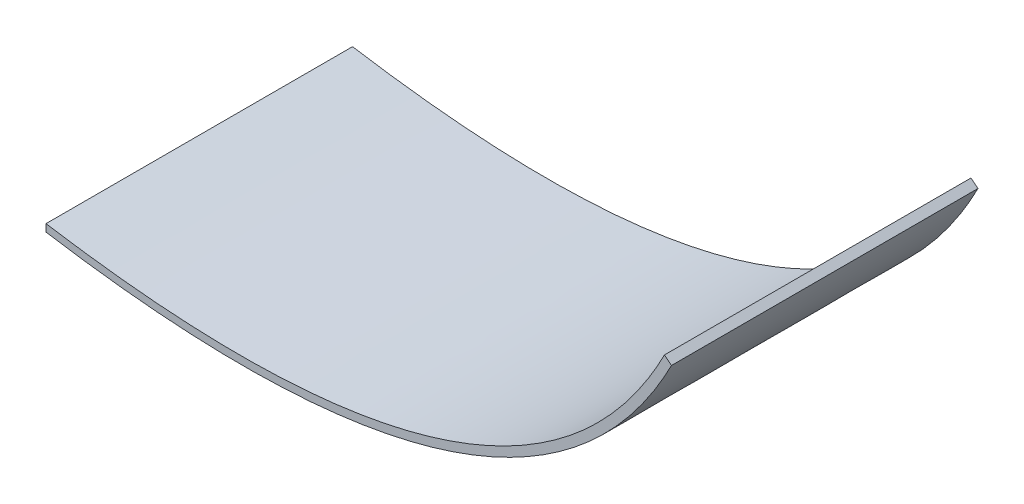
ISO-10303-21;
HEADER;
FILE_DESCRIPTION(('STEP AP214'),'2;1');
FILE_NAME('part.step','',(''),(''),'','','');
FILE_SCHEMA(('AUTOMOTIVE_DESIGN { 1 0 10303 214 1 1 1 1 }'));
ENDSEC;
DATA;
#1=APPLICATION_CONTEXT('core data for automotive mechanical design processes');
#2=APPLICATION_PROTOCOL_DEFINITION('international standard','automotive_design',2000,#1);
#3=PRODUCT_CONTEXT('',#1,'mechanical');
#4=PRODUCT('Part','Part','',(#3));
#5=PRODUCT_RELATED_PRODUCT_CATEGORY('part','',(#4));
#6=PRODUCT_DEFINITION_FORMATION('','',#4);
#7=PRODUCT_DEFINITION_CONTEXT('part definition',#1,'design');
#8=PRODUCT_DEFINITION('design','',#6,#7);
#9=PRODUCT_DEFINITION_SHAPE('','',#8);
#10=(LENGTH_UNIT() NAMED_UNIT(*) SI_UNIT(.MILLI.,.METRE.));
#11=(NAMED_UNIT(*) PLANE_ANGLE_UNIT() SI_UNIT($,.RADIAN.));
#12=(NAMED_UNIT(*) SI_UNIT($,.STERADIAN.) SOLID_ANGLE_UNIT());
#13=UNCERTAINTY_MEASURE_WITH_UNIT(LENGTH_MEASURE(1.E-05),#10,'distance_accuracy_value','');
#14=(GEOMETRIC_REPRESENTATION_CONTEXT(3) GLOBAL_UNCERTAINTY_ASSIGNED_CONTEXT((#13)) GLOBAL_UNIT_ASSIGNED_CONTEXT((#10,
#11,#12)) REPRESENTATION_CONTEXT('',''));
#15=CARTESIAN_POINT('',(0.,0.,0.));
#16=DIRECTION('',(0.,0.,1.));
#17=DIRECTION('',(1.,0.,0.));
#18=AXIS2_PLACEMENT_3D('',#15,#16,#17);
#19=CARTESIAN_POINT('',(89.4859572467948,186.135672215058,203.2));
#20=DIRECTION('',(0.618421676323232,0.785846441904246,0.));
#21=DIRECTION('',(-0.785846441904246,0.618421676323232,0.));
#22=AXIS2_PLACEMENT_3D('',#19,#20,#21);
#23=PLANE('',#22);
#24=DIRECTION('',(0.785846441904246,-0.618421676323232,0.));
#25=VECTOR('',#24,1.);
#26=CARTESIAN_POINT('',(89.4859572467948,186.135672215058,0.));
#27=LINE('',#26,#25);
#28=CARTESIAN_POINT('',(89.4859572467948,186.135672215058,0.));
#29=VERTEX_POINT('',#28);
#30=CARTESIAN_POINT('',(94.1694616418915,182.449989510858,0.));
#31=VERTEX_POINT('',#30);
#32=EDGE_CURVE('E115',#29,#31,#27,.T.);
#33=ORIENTED_EDGE('',*,*,#32,.F.);
#34=DIRECTION('',(0.,0.,-1.));
#35=VECTOR('',#34,1.);
#36=CARTESIAN_POINT('',(89.4859572467948,186.135672215058,203.2));
#37=LINE('',#36,#35);
#38=CARTESIAN_POINT('',(89.4859572467948,186.135672215058,203.2));
#39=VERTEX_POINT('',#38);
#40=EDGE_CURVE('E11',#39,#29,#37,.T.);
#41=ORIENTED_EDGE('',*,*,#40,.F.);
#42=DIRECTION('',(0.785846441904246,-0.618421676323232,0.));
#43=VECTOR('',#42,1.);
#44=CARTESIAN_POINT('',(89.4859572467948,186.135672215058,203.2));
#45=LINE('',#44,#43);
#46=CARTESIAN_POINT('',(94.1694616418915,182.449989510858,203.2));
#47=VERTEX_POINT('',#46);
#48=EDGE_CURVE('E91',#39,#47,#45,.T.);
#49=ORIENTED_EDGE('',*,*,#48,.T.);
#50=DIRECTION('',(0.,0.,-1.));
#51=VECTOR('',#50,1.);
#52=CARTESIAN_POINT('',(94.1694616418915,182.449989510858,203.2));
#53=LINE('',#52,#51);
#54=EDGE_CURVE('E36',#47,#31,#53,.T.);
#55=ORIENTED_EDGE('',*,*,#54,.T.);
#56=EDGE_LOOP('',(#33,#41,#49,#55));
#57=FACE_BOUND('',#56,.T.);
#58=ADVANCED_FACE('F33',(#57),#23,.T.);
#59=CARTESIAN_POINT('',(-320.509235210405,56.5432881175991,203.2));
#60=CARTESIAN_POINT('',(-3.74461892229794,5.50473998325045,203.2));
#61=CARTESIAN_POINT('',(89.4859572467948,186.135672215058,203.2));
#62=B_SPLINE_CURVE_WITH_KNOTS('',2,(#59,#60,#61),.UNSPECIFIED.,.F.,.F.,(3,3),(0.,1.),.UNSPECIFIED.);
#63=DIRECTION('',(0.,0.,-1.));
#64=VECTOR('',#63,1.);
#65=SURFACE_OF_LINEAR_EXTRUSION('',#62,#64);
#66=CARTESIAN_POINT('',(-320.509235210405,56.5432881175991,0.));
#67=CARTESIAN_POINT('',(-3.74461892229794,5.50473998325045,0.));
#68=CARTESIAN_POINT('',(89.4859572467948,186.135672215058,0.));
#69=B_SPLINE_CURVE_WITH_KNOTS('',2,(#66,#67,#68),.UNSPECIFIED.,.F.,.F.,(3,3),(0.,1.),.UNSPECIFIED.);
#70=CARTESIAN_POINT('',(-320.509235210405,56.5432881175991,0.));
#71=VERTEX_POINT('',#70);
#72=EDGE_CURVE('E93',#71,#29,#69,.T.);
#73=ORIENTED_EDGE('',*,*,#72,.F.);
#74=DIRECTION('',(0.,0.,-1.));
#75=VECTOR('',#74,1.);
#76=CARTESIAN_POINT('',(-320.509235210405,56.5432881175991,203.2));
#77=LINE('',#76,#75);
#78=CARTESIAN_POINT('',(-320.509235210405,56.5432881175991,203.2));
#79=VERTEX_POINT('',#78);
#80=EDGE_CURVE('E42',#79,#71,#77,.T.);
#81=ORIENTED_EDGE('',*,*,#80,.F.);
#82=EDGE_CURVE('E81',#79,#39,#62,.T.);
#83=ORIENTED_EDGE('',*,*,#82,.T.);
#84=ORIENTED_EDGE('',*,*,#40,.T.);
#85=EDGE_LOOP('',(#73,#81,#83,#84));
#86=FACE_BOUND('',#85,.T.);
#87=ADVANCED_FACE('F106',(#86),#65,.T.);
#88=CARTESIAN_POINT('',(-320.509235210405,56.5432881175991,203.2));
#89=DIRECTION('',(0.999999136287931,-0.00131431479976401,0.));
#90=DIRECTION('',(0.00131431479976401,0.999999136287931,0.));
#91=AXIS2_PLACEMENT_3D('',#88,#89,#90);
#92=PLANE('',#91);
#93=DIRECTION('',(-0.00131431479976401,-0.999999136287931,0.));
#94=VECTOR('',#93,1.);
#95=CARTESIAN_POINT('',(-320.509235210405,56.5432881175991,0.));
#96=LINE('',#95,#94);
#97=CARTESIAN_POINT('',(-320.51567582152,51.6429358175259,0.));
#98=VERTEX_POINT('',#97);
#99=EDGE_CURVE('E86',#71,#98,#96,.T.);
#100=ORIENTED_EDGE('',*,*,#99,.T.);
#101=DIRECTION('',(0.,0.,-1.));
#102=VECTOR('',#101,1.);
#103=CARTESIAN_POINT('',(-320.51567582152,51.6429358175259,203.2));
#104=LINE('',#103,#102);
#105=CARTESIAN_POINT('',(-320.51567582152,51.6429358175259,203.2));
#106=VERTEX_POINT('',#105);
#107=EDGE_CURVE('E84',#106,#98,#104,.T.);
#108=ORIENTED_EDGE('',*,*,#107,.F.);
#109=DIRECTION('',(-0.00131431479976401,-0.999999136287931,0.));
#110=VECTOR('',#109,1.);
#111=CARTESIAN_POINT('',(-320.509235210405,56.5432881175991,203.2));
#112=LINE('',#111,#110);
#113=EDGE_CURVE('E78',#79,#106,#112,.T.);
#114=ORIENTED_EDGE('',*,*,#113,.F.);
#115=ORIENTED_EDGE('',*,*,#80,.T.);
#116=EDGE_LOOP('',(#100,#108,#114,#115));
#117=FACE_BOUND('',#116,.T.);
#118=ADVANCED_FACE('F85',(#117),#92,.F.);
#119=CARTESIAN_POINT('',(-320.51567582152,51.6429358175259,203.2));
#120=CARTESIAN_POINT('',(0.,0.,203.2));
#121=CARTESIAN_POINT('',(94.1694616418915,182.449989510858,203.2));
#122=B_SPLINE_CURVE_WITH_KNOTS('',2,(#119,#120,#121),.UNSPECIFIED.,.F.,.F.,(3,3),(0.,1.),.UNSPECIFIED.);
#123=DIRECTION('',(0.,0.,-1.));
#124=VECTOR('',#123,1.);
#125=SURFACE_OF_LINEAR_EXTRUSION('',#122,#124);
#126=CARTESIAN_POINT('',(-320.51567582152,51.6429358175259,0.));
#127=CARTESIAN_POINT('',(0.,0.,0.));
#128=CARTESIAN_POINT('',(94.1694616418915,182.449989510858,0.));
#129=B_SPLINE_CURVE_WITH_KNOTS('',2,(#126,#127,#128),.UNSPECIFIED.,.F.,.F.,(3,3),(0.,1.),.UNSPECIFIED.);
#130=EDGE_CURVE('E121',#98,#31,#129,.T.);
#131=ORIENTED_EDGE('',*,*,#130,.T.);
#132=ORIENTED_EDGE('',*,*,#54,.F.);
#133=EDGE_CURVE('E75',#106,#47,#122,.T.);
#134=ORIENTED_EDGE('',*,*,#133,.F.);
#135=ORIENTED_EDGE('',*,*,#107,.T.);
#136=EDGE_LOOP('',(#131,#132,#134,#135));
#137=FACE_BOUND('',#136,.T.);
#138=ADVANCED_FACE('F90',(#137),#125,.F.);
#139=CARTESIAN_POINT('',(-56.5865535449071,58.5232313320961,203.2));
#140=DIRECTION('',(0.,0.,-1.));
#141=DIRECTION('',(-1.,0.,0.));
#142=AXIS2_PLACEMENT_3D('',#139,#140,#141);
#143=PLANE('',#142);
#144=ORIENTED_EDGE('',*,*,#48,.F.);
#145=ORIENTED_EDGE('',*,*,#82,.F.);
#146=ORIENTED_EDGE('',*,*,#113,.T.);
#147=ORIENTED_EDGE('',*,*,#133,.T.);
#148=EDGE_LOOP('',(#144,#145,#146,#147));
#149=FACE_BOUND('',#148,.T.);
#150=ADVANCED_FACE('F80',(#149),#143,.F.);
#151=CARTESIAN_POINT('',(-56.5865535449071,58.5232313320961,0.));
#152=DIRECTION('',(0.,0.,-1.));
#153=DIRECTION('',(-1.,0.,0.));
#154=AXIS2_PLACEMENT_3D('',#151,#152,#153);
#155=PLANE('',#154);
#156=ORIENTED_EDGE('',*,*,#32,.T.);
#157=ORIENTED_EDGE('',*,*,#130,.F.);
#158=ORIENTED_EDGE('',*,*,#99,.F.);
#159=ORIENTED_EDGE('',*,*,#72,.T.);
#160=EDGE_LOOP('',(#156,#157,#158,#159));
#161=FACE_BOUND('',#160,.T.);
#162=ADVANCED_FACE('F109',(#161),#155,.T.);
#163=CLOSED_SHELL('',(#58,#87,#118,#138,#150,#162));
#164=MANIFOLD_SOLID_BREP('B2',#163);
#165=ADVANCED_BREP_SHAPE_REPRESENTATION('',(#18,#164),#14);
#166=SHAPE_DEFINITION_REPRESENTATION(#9,#165);
ENDSEC;
END-ISO-10303-21;
